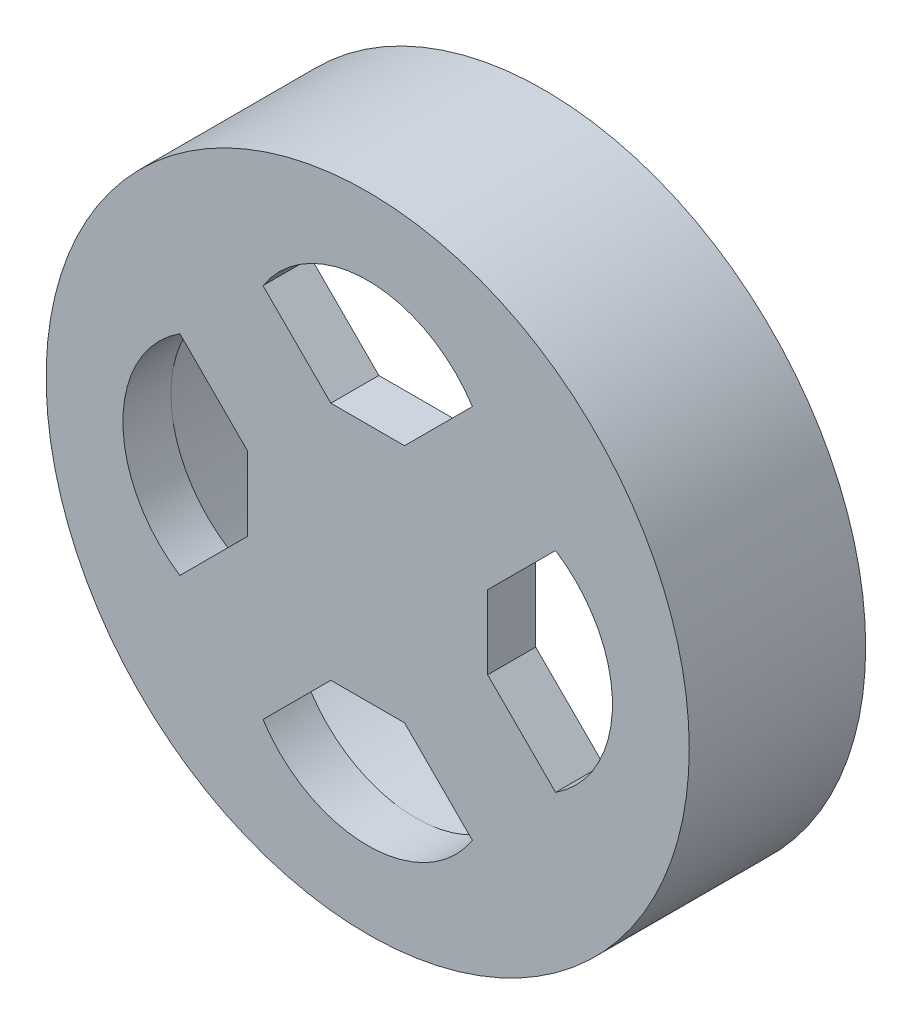
ISO-10303-21;
HEADER;
FILE_DESCRIPTION(('STEP AP214'),'2;1');
FILE_NAME('part.step','',(''),(''),'','','');
FILE_SCHEMA(('AUTOMOTIVE_DESIGN { 1 0 10303 214 1 1 1 1 }'));
ENDSEC;
DATA;
#1=APPLICATION_CONTEXT('core data for automotive mechanical design processes');
#2=APPLICATION_PROTOCOL_DEFINITION('international standard','automotive_design',2000,#1);
#3=PRODUCT_CONTEXT('',#1,'mechanical');
#4=PRODUCT('Part','Part','',(#3));
#5=PRODUCT_RELATED_PRODUCT_CATEGORY('part','',(#4));
#6=PRODUCT_DEFINITION_FORMATION('','',#4);
#7=PRODUCT_DEFINITION_CONTEXT('part definition',#1,'design');
#8=PRODUCT_DEFINITION('design','',#6,#7);
#9=PRODUCT_DEFINITION_SHAPE('','',#8);
#10=(LENGTH_UNIT() NAMED_UNIT(*) SI_UNIT(.MILLI.,.METRE.));
#11=(NAMED_UNIT(*) PLANE_ANGLE_UNIT() SI_UNIT($,.RADIAN.));
#12=(NAMED_UNIT(*) SI_UNIT($,.STERADIAN.) SOLID_ANGLE_UNIT());
#13=UNCERTAINTY_MEASURE_WITH_UNIT(LENGTH_MEASURE(1.E-05),#10,'distance_accuracy_value','');
#14=(GEOMETRIC_REPRESENTATION_CONTEXT(3) GLOBAL_UNCERTAINTY_ASSIGNED_CONTEXT((#13)) GLOBAL_UNIT_ASSIGNED_CONTEXT((#10,
#11,#12)) REPRESENTATION_CONTEXT('',''));
#15=CARTESIAN_POINT('',(0.,0.,0.));
#16=DIRECTION('',(0.,0.,1.));
#17=DIRECTION('',(1.,0.,0.));
#18=AXIS2_PLACEMENT_3D('',#15,#16,#17);
#19=CARTESIAN_POINT('',(0.,0.,18.38));
#20=DIRECTION('',(0.,0.,-1.));
#21=DIRECTION('',(-1.,0.,0.));
#22=AXIS2_PLACEMENT_3D('',#19,#20,#21);
#23=CYLINDRICAL_SURFACE('',#22,33.5);
#24=CARTESIAN_POINT('',(0.,0.,18.38));
#25=DIRECTION('',(0.,0.,1.));
#26=DIRECTION('',(1.,0.,0.));
#27=AXIS2_PLACEMENT_3D('',#24,#25,#26);
#28=CIRCLE('',#27,33.5);
#29=CARTESIAN_POINT('',(33.5,0.,18.38));
#30=VERTEX_POINT('',#29);
#31=EDGE_CURVE('E42',#30,#30,#28,.T.);
#32=ORIENTED_EDGE('',*,*,#31,.F.);
#33=EDGE_LOOP('',(#32));
#34=FACE_BOUND('',#33,.T.);
#35=CARTESIAN_POINT('',(0.,0.,0.));
#36=DIRECTION('',(0.,0.,1.));
#37=DIRECTION('',(1.,0.,0.));
#38=AXIS2_PLACEMENT_3D('',#35,#36,#37);
#39=CIRCLE('',#38,33.5);
#40=CARTESIAN_POINT('',(33.5,0.,0.));
#41=VERTEX_POINT('',#40);
#42=EDGE_CURVE('E365',#41,#41,#39,.T.);
#43=ORIENTED_EDGE('',*,*,#42,.T.);
#44=EDGE_LOOP('',(#43));
#45=FACE_BOUND('',#44,.T.);
#46=ADVANCED_FACE('F35',(#34,#45),#23,.T.);
#47=CARTESIAN_POINT('',(0.,0.,18.38));
#48=DIRECTION('',(0.,0.,1.));
#49=DIRECTION('',(1.,0.,0.));
#50=AXIS2_PLACEMENT_3D('',#47,#48,#49);
#51=PLANE('',#50);
#52=CARTESIAN_POINT('',(0.,12.5,18.38));
#53=DIRECTION('',(0.,0.,1.));
#54=DIRECTION('',(1.,0.,0.));
#55=AXIS2_PLACEMENT_3D('',#52,#53,#54);
#56=CIRCLE('',#55,13.);
#57=CARTESIAN_POINT('',(10.9087121146357,19.5710678118655,18.38));
#58=VERTEX_POINT('',#57);
#59=CARTESIAN_POINT('',(-10.9087121146357,19.5710678118655,18.38));
#60=VERTEX_POINT('',#59);
#61=EDGE_CURVE('E363',#58,#60,#56,.T.);
#62=ORIENTED_EDGE('',*,*,#61,.F.);
#63=DIRECTION('',(0.707106781186546,0.707106781186549,0.));
#64=VECTOR('',#63,1.);
#65=CARTESIAN_POINT('',(-4.33117784861485,4.33117784861483,18.38));
#66=LINE('',#65,#64);
#67=CARTESIAN_POINT('',(3.83764430277029,12.5,18.38));
#68=VERTEX_POINT('',#67);
#69=EDGE_CURVE('E356',#68,#58,#66,.T.);
#70=ORIENTED_EDGE('',*,*,#69,.F.);
#71=DIRECTION('',(1.,0.,0.));
#72=VECTOR('',#71,1.);
#73=CARTESIAN_POINT('',(0.,12.5,18.38));
#74=LINE('',#73,#72);
#75=CARTESIAN_POINT('',(-3.83764430277029,12.5,18.38));
#76=VERTEX_POINT('',#75);
#77=EDGE_CURVE('E358',#76,#68,#74,.T.);
#78=ORIENTED_EDGE('',*,*,#77,.F.);
#79=DIRECTION('',(0.707106781186546,-0.707106781186549,0.));
#80=VECTOR('',#79,1.);
#81=CARTESIAN_POINT('',(4.33117784861485,4.33117784861483,18.38));
#82=LINE('',#81,#80);
#83=EDGE_CURVE('E361',#60,#76,#82,.T.);
#84=ORIENTED_EDGE('',*,*,#83,.F.);
#85=EDGE_LOOP('',(#62,#70,#78,#84));
#86=FACE_BOUND('',#85,.T.);
#87=CARTESIAN_POINT('',(-12.5,0.,18.38));
#88=DIRECTION('',(0.,0.,1.));
#89=DIRECTION('',(1.,0.,0.));
#90=AXIS2_PLACEMENT_3D('',#87,#88,#89);
#91=CIRCLE('',#90,13.);
#92=CARTESIAN_POINT('',(-19.5710678118655,10.9087121146357,18.38));
#93=VERTEX_POINT('',#92);
#94=CARTESIAN_POINT('',(-19.5710678118655,-10.9087121146358,18.38));
#95=VERTEX_POINT('',#94);
#96=EDGE_CURVE('E354',#93,#95,#91,.T.);
#97=ORIENTED_EDGE('',*,*,#96,.F.);
#98=DIRECTION('',(-0.707106781186551,0.707106781186544,0.));
#99=VECTOR('',#98,1.);
#100=CARTESIAN_POINT('',(-4.33117784861482,-4.33117784861486,18.38));
#101=LINE('',#100,#99);
#102=CARTESIAN_POINT('',(-12.5,3.83764430277024,18.38));
#103=VERTEX_POINT('',#102);
#104=EDGE_CURVE('E347',#103,#93,#101,.T.);
#105=ORIENTED_EDGE('',*,*,#104,.F.);
#106=DIRECTION('',(0.,1.,0.));
#107=VECTOR('',#106,1.);
#108=CARTESIAN_POINT('',(-12.5,0.,18.38));
#109=LINE('',#108,#107);
#110=CARTESIAN_POINT('',(-12.5,-3.83764430277033,18.38));
#111=VERTEX_POINT('',#110);
#112=EDGE_CURVE('E349',#111,#103,#109,.T.);
#113=ORIENTED_EDGE('',*,*,#112,.F.);
#114=DIRECTION('',(0.707106781186547,0.707106781186549,0.));
#115=VECTOR('',#114,1.);
#116=CARTESIAN_POINT('',(-4.33117784861484,4.33117784861483,18.38));
#117=LINE('',#116,#115);
#118=EDGE_CURVE('E352',#95,#111,#117,.T.);
#119=ORIENTED_EDGE('',*,*,#118,.F.);
#120=EDGE_LOOP('',(#97,#105,#113,#119));
#121=FACE_BOUND('',#120,.T.);
#122=CARTESIAN_POINT('',(-7.05950310263298E-13,-12.5,18.38));
#123=DIRECTION('',(0.,0.,1.));
#124=DIRECTION('',(1.,0.,0.));
#125=AXIS2_PLACEMENT_3D('',#122,#123,#124);
#126=CIRCLE('',#125,13.);
#127=CARTESIAN_POINT('',(-10.9087121146365,-19.5710678118655,18.38));
#128=VERTEX_POINT('',#127);
#129=CARTESIAN_POINT('',(10.908712114635,-19.5710678118655,18.38));
#130=VERTEX_POINT('',#129);
#131=EDGE_CURVE('E345',#128,#130,#126,.T.);
#132=ORIENTED_EDGE('',*,*,#131,.F.);
#133=DIRECTION('',(-0.707106781186546,-0.707106781186549,0.));
#134=VECTOR('',#133,1.);
#135=CARTESIAN_POINT('',(4.3311778486145,-4.33117784861448,18.38));
#136=LINE('',#135,#134);
#137=CARTESIAN_POINT('',(-3.83764430277099,-12.5,18.38));
#138=VERTEX_POINT('',#137);
#139=EDGE_CURVE('E338',#138,#128,#136,.T.);
#140=ORIENTED_EDGE('',*,*,#139,.F.);
#141=DIRECTION('',(-1.,0.,0.));
#142=VECTOR('',#141,1.);
#143=CARTESIAN_POINT('',(0.,-12.5,18.38));
#144=LINE('',#143,#142);
#145=CARTESIAN_POINT('',(3.83764430276958,-12.5,18.38));
#146=VERTEX_POINT('',#145);
#147=EDGE_CURVE('E340',#146,#138,#144,.T.);
#148=ORIENTED_EDGE('',*,*,#147,.F.);
#149=DIRECTION('',(-0.707106781186546,0.707106781186549,0.));
#150=VECTOR('',#149,1.);
#151=CARTESIAN_POINT('',(-4.3311778486152,-4.33117784861519,18.38));
#152=LINE('',#151,#150);
#153=EDGE_CURVE('E343',#130,#146,#152,.T.);
#154=ORIENTED_EDGE('',*,*,#153,.F.);
#155=EDGE_LOOP('',(#132,#140,#148,#154));
#156=FACE_BOUND('',#155,.T.);
#157=CARTESIAN_POINT('',(12.5,1.30930550206618E-13,18.38));
#158=DIRECTION('',(0.,0.,1.));
#159=DIRECTION('',(1.,0.,0.));
#160=AXIS2_PLACEMENT_3D('',#157,#158,#159);
#161=CIRCLE('',#160,13.);
#162=CARTESIAN_POINT('',(19.5710678118656,-10.9087121146355,18.38));
#163=VERTEX_POINT('',#162);
#164=CARTESIAN_POINT('',(19.5710678118654,10.908712114636,18.38));
#165=VERTEX_POINT('',#164);
#166=EDGE_CURVE('E336',#163,#165,#161,.T.);
#167=ORIENTED_EDGE('',*,*,#166,.F.);
#168=DIRECTION('',(0.707106781186556,-0.707106781186539,0.));
#169=VECTOR('',#168,1.);
#170=CARTESIAN_POINT('',(4.33117784861478,4.33117784861489,18.38));
#171=LINE('',#170,#169);
#172=CARTESIAN_POINT('',(12.5,-3.83764430277016,18.38));
#173=VERTEX_POINT('',#172);
#174=EDGE_CURVE('E284',#173,#163,#171,.T.);
#175=ORIENTED_EDGE('',*,*,#174,.F.);
#176=DIRECTION('',(0.,-1.,0.));
#177=VECTOR('',#176,1.);
#178=CARTESIAN_POINT('',(12.5,1.29958109714157E-13,18.38));
#179=LINE('',#178,#177);
#180=CARTESIAN_POINT('',(12.5,3.83764430277042,18.38));
#181=VERTEX_POINT('',#180);
#182=EDGE_CURVE('E331',#181,#173,#179,.T.);
#183=ORIENTED_EDGE('',*,*,#182,.F.);
#184=DIRECTION('',(-0.707106781186542,-0.707106781186553,0.));
#185=VECTOR('',#184,1.);
#186=CARTESIAN_POINT('',(4.33117784861487,-4.3311778486148,18.38));
#187=LINE('',#186,#185);
#188=EDGE_CURVE('E334',#165,#181,#187,.T.);
#189=ORIENTED_EDGE('',*,*,#188,.F.);
#190=EDGE_LOOP('',(#167,#175,#183,#189));
#191=FACE_BOUND('',#190,.T.);
#192=ORIENTED_EDGE('',*,*,#31,.T.);
#193=EDGE_LOOP('',(#192));
#194=FACE_BOUND('',#193,.T.);
#195=ADVANCED_FACE('F374',(#86,#121,#156,#191,#194),#51,.T.);
#196=CARTESIAN_POINT('',(0.,0.,0.));
#197=DIRECTION('',(0.,0.,1.));
#198=DIRECTION('',(1.,0.,0.));
#199=AXIS2_PLACEMENT_3D('',#196,#197,#198);
#200=PLANE('',#199);
#201=CARTESIAN_POINT('',(0.,0.,0.));
#202=DIRECTION('',(0.,0.,-1.));
#203=DIRECTION('',(-1.,0.,0.));
#204=AXIS2_PLACEMENT_3D('',#201,#202,#203);
#205=CIRCLE('',#204,25.5);
#206=CARTESIAN_POINT('',(-25.5,0.,0.));
#207=VERTEX_POINT('',#206);
#208=EDGE_CURVE('E225',#207,#207,#205,.T.);
#209=ORIENTED_EDGE('',*,*,#208,.F.);
#210=EDGE_LOOP('',(#209));
#211=FACE_BOUND('',#210,.T.);
#212=ORIENTED_EDGE('',*,*,#42,.F.);
#213=EDGE_LOOP('',(#212));
#214=FACE_BOUND('',#213,.T.);
#215=ADVANCED_FACE('F371',(#211,#214),#200,.F.);
#216=CARTESIAN_POINT('',(12.5,1.30930550206618E-13,18.5));
#217=DIRECTION('',(0.,0.,-1.));
#218=DIRECTION('',(-1.,0.,0.));
#219=AXIS2_PLACEMENT_3D('',#216,#217,#218);
#220=CYLINDRICAL_SURFACE('',#219,13.);
#221=CARTESIAN_POINT('',(12.5,1.30930550206618E-13,13.38));
#222=DIRECTION('',(0.,0.,1.));
#223=DIRECTION('',(1.,0.,0.));
#224=AXIS2_PLACEMENT_3D('',#221,#222,#223);
#225=CIRCLE('',#224,13.);
#226=CARTESIAN_POINT('',(19.5710678118654,10.908712114636,13.38));
#227=VERTEX_POINT('',#226);
#228=CARTESIAN_POINT('',(25.5,2.670983224215E-13,13.38));
#229=VERTEX_POINT('',#228);
#230=EDGE_CURVE('E277',#227,#229,#225,.F.);
#231=ORIENTED_EDGE('',*,*,#230,.T.);
#232=CARTESIAN_POINT('',(19.5710678118656,-10.9087121146355,13.38));
#233=VERTEX_POINT('',#232);
#234=EDGE_CURVE('E280',#229,#233,#225,.F.);
#235=ORIENTED_EDGE('',*,*,#234,.T.);
#236=DIRECTION('',(0.,0.,-1.));
#237=VECTOR('',#236,1.);
#238=CARTESIAN_POINT('',(19.5710678118656,-10.9087121146355,18.5));
#239=LINE('',#238,#237);
#240=EDGE_CURVE('E327',#163,#233,#239,.T.);
#241=ORIENTED_EDGE('',*,*,#240,.F.);
#242=ORIENTED_EDGE('',*,*,#166,.T.);
#243=DIRECTION('',(0.,0.,-1.));
#244=VECTOR('',#243,1.);
#245=CARTESIAN_POINT('',(19.5710678118654,10.908712114636,18.5));
#246=LINE('',#245,#244);
#247=EDGE_CURVE('E318',#165,#227,#246,.T.);
#248=ORIENTED_EDGE('',*,*,#247,.T.);
#249=EDGE_LOOP('',(#231,#235,#241,#242,#248));
#250=FACE_BOUND('',#249,.T.);
#251=ADVANCED_FACE('F373',(#250),#220,.F.);
#252=CARTESIAN_POINT('',(12.5,3.83764430277042,18.5));
#253=DIRECTION('',(-0.707106781186553,0.707106781186542,0.));
#254=DIRECTION('',(-0.707106781186542,-0.707106781186553,0.));
#255=AXIS2_PLACEMENT_3D('',#252,#253,#254);
#256=PLANE('',#255);
#257=DIRECTION('',(0.,0.,-1.));
#258=VECTOR('',#257,1.);
#259=CARTESIAN_POINT('',(12.5,3.83764430277042,18.5));
#260=LINE('',#259,#258);
#261=CARTESIAN_POINT('',(12.5,3.83764430277042,13.38));
#262=VERTEX_POINT('',#261);
#263=EDGE_CURVE('E321',#181,#262,#260,.T.);
#264=ORIENTED_EDGE('',*,*,#263,.T.);
#265=DIRECTION('',(0.707106781186542,0.707106781186553,0.));
#266=VECTOR('',#265,1.);
#267=CARTESIAN_POINT('',(12.5,3.83764430277042,13.38));
#268=LINE('',#267,#266);
#269=EDGE_CURVE('E274',#262,#227,#268,.T.);
#270=ORIENTED_EDGE('',*,*,#269,.T.);
#271=ORIENTED_EDGE('',*,*,#247,.F.);
#272=ORIENTED_EDGE('',*,*,#188,.T.);
#273=EDGE_LOOP('',(#264,#270,#271,#272));
#274=FACE_BOUND('',#273,.T.);
#275=ADVANCED_FACE('F380',(#274),#256,.F.);
#276=CARTESIAN_POINT('',(12.5,-3.83764430277016,18.5));
#277=DIRECTION('',(-1.,0.,0.));
#278=DIRECTION('',(0.,-1.,0.));
#279=AXIS2_PLACEMENT_3D('',#276,#277,#278);
#280=PLANE('',#279);
#281=DIRECTION('',(0.,0.,-1.));
#282=VECTOR('',#281,1.);
#283=CARTESIAN_POINT('',(12.5,-3.83764430277016,18.5));
#284=LINE('',#283,#282);
#285=CARTESIAN_POINT('',(12.5,-3.83764430277016,13.38));
#286=VERTEX_POINT('',#285);
#287=EDGE_CURVE('E324',#173,#286,#284,.T.);
#288=ORIENTED_EDGE('',*,*,#287,.T.);
#289=DIRECTION('',(0.,1.,0.));
#290=VECTOR('',#289,1.);
#291=CARTESIAN_POINT('',(12.5,-3.83764430277016,13.38));
#292=LINE('',#291,#290);
#293=EDGE_CURVE('E57',#286,#262,#292,.T.);
#294=ORIENTED_EDGE('',*,*,#293,.T.);
#295=ORIENTED_EDGE('',*,*,#263,.F.);
#296=ORIENTED_EDGE('',*,*,#182,.T.);
#297=EDGE_LOOP('',(#288,#294,#295,#296));
#298=FACE_BOUND('',#297,.T.);
#299=ADVANCED_FACE('F415',(#298),#280,.F.);
#300=CARTESIAN_POINT('',(19.5710678118656,-10.9087121146355,18.5));
#301=DIRECTION('',(-0.707106781186539,-0.707106781186556,0.));
#302=DIRECTION('',(0.707106781186556,-0.707106781186539,0.));
#303=AXIS2_PLACEMENT_3D('',#300,#301,#302);
#304=PLANE('',#303);
#305=ORIENTED_EDGE('',*,*,#240,.T.);
#306=DIRECTION('',(-0.707106781186556,0.707106781186539,0.));
#307=VECTOR('',#306,1.);
#308=CARTESIAN_POINT('',(19.5710678118656,-10.9087121146355,13.38));
#309=LINE('',#308,#307);
#310=EDGE_CURVE('E271',#233,#286,#309,.T.);
#311=ORIENTED_EDGE('',*,*,#310,.T.);
#312=ORIENTED_EDGE('',*,*,#287,.F.);
#313=ORIENTED_EDGE('',*,*,#174,.T.);
#314=EDGE_LOOP('',(#305,#311,#312,#313));
#315=FACE_BOUND('',#314,.T.);
#316=ADVANCED_FACE('F425',(#315),#304,.F.);
#317=CARTESIAN_POINT('',(-7.05950310263298E-13,-12.5,18.5));
#318=DIRECTION('',(0.,0.,-1.));
#319=DIRECTION('',(-1.,0.,0.));
#320=AXIS2_PLACEMENT_3D('',#317,#318,#319);
#321=CYLINDRICAL_SURFACE('',#320,13.);
#322=CARTESIAN_POINT('',(-7.05950310263298E-13,-12.5,13.38));
#323=DIRECTION('',(0.,0.,1.));
#324=DIRECTION('',(1.,0.,0.));
#325=AXIS2_PLACEMENT_3D('',#322,#323,#324);
#326=CIRCLE('',#325,13.);
#327=CARTESIAN_POINT('',(10.908712114635,-19.5710678118655,13.38));
#328=VERTEX_POINT('',#327);
#329=CARTESIAN_POINT('',(-1.44013863293713E-12,-25.5,13.38));
#330=VERTEX_POINT('',#329);
#331=EDGE_CURVE('E267',#328,#330,#326,.F.);
#332=ORIENTED_EDGE('',*,*,#331,.T.);
#333=CARTESIAN_POINT('',(-10.9087121146365,-19.5710678118655,13.38));
#334=VERTEX_POINT('',#333);
#335=EDGE_CURVE('E270',#330,#334,#326,.F.);
#336=ORIENTED_EDGE('',*,*,#335,.T.);
#337=DIRECTION('',(0.,0.,-1.));
#338=VECTOR('',#337,1.);
#339=CARTESIAN_POINT('',(-10.9087121146365,-19.5710678118655,18.5));
#340=LINE('',#339,#338);
#341=EDGE_CURVE('E315',#128,#334,#340,.T.);
#342=ORIENTED_EDGE('',*,*,#341,.F.);
#343=ORIENTED_EDGE('',*,*,#131,.T.);
#344=DIRECTION('',(0.,0.,-1.));
#345=VECTOR('',#344,1.);
#346=CARTESIAN_POINT('',(10.908712114635,-19.5710678118655,18.5));
#347=LINE('',#346,#345);
#348=EDGE_CURVE('E306',#130,#328,#347,.T.);
#349=ORIENTED_EDGE('',*,*,#348,.T.);
#350=EDGE_LOOP('',(#332,#336,#342,#343,#349));
#351=FACE_BOUND('',#350,.T.);
#352=ADVANCED_FACE('F435',(#351),#321,.F.);
#353=CARTESIAN_POINT('',(3.83764430276958,-12.5,18.5));
#354=DIRECTION('',(0.707106781186549,0.707106781186546,0.));
#355=DIRECTION('',(-0.707106781186546,0.707106781186549,0.));
#356=AXIS2_PLACEMENT_3D('',#353,#354,#355);
#357=PLANE('',#356);
#358=DIRECTION('',(0.,0.,-1.));
#359=VECTOR('',#358,1.);
#360=CARTESIAN_POINT('',(3.83764430276958,-12.5,18.5));
#361=LINE('',#360,#359);
#362=CARTESIAN_POINT('',(3.83764430276958,-12.5,13.38));
#363=VERTEX_POINT('',#362);
#364=EDGE_CURVE('E309',#146,#363,#361,.T.);
#365=ORIENTED_EDGE('',*,*,#364,.T.);
#366=DIRECTION('',(0.707106781186546,-0.707106781186549,0.));
#367=VECTOR('',#366,1.);
#368=CARTESIAN_POINT('',(3.83764430276958,-12.5,13.38));
#369=LINE('',#368,#367);
#370=EDGE_CURVE('E264',#363,#328,#369,.T.);
#371=ORIENTED_EDGE('',*,*,#370,.T.);
#372=ORIENTED_EDGE('',*,*,#348,.F.);
#373=ORIENTED_EDGE('',*,*,#153,.T.);
#374=EDGE_LOOP('',(#365,#371,#372,#373));
#375=FACE_BOUND('',#374,.T.);
#376=ADVANCED_FACE('F445',(#375),#357,.F.);
#377=CARTESIAN_POINT('',(-3.83764430277099,-12.5,18.5));
#378=DIRECTION('',(0.,1.,0.));
#379=DIRECTION('',(0.,0.,1.));
#380=AXIS2_PLACEMENT_3D('',#377,#378,#379);
#381=PLANE('',#380);
#382=DIRECTION('',(0.,0.,-1.));
#383=VECTOR('',#382,1.);
#384=CARTESIAN_POINT('',(-3.83764430277099,-12.5,18.5));
#385=LINE('',#384,#383);
#386=CARTESIAN_POINT('',(-3.83764430277099,-12.5,13.38));
#387=VERTEX_POINT('',#386);
#388=EDGE_CURVE('E312',#138,#387,#385,.T.);
#389=ORIENTED_EDGE('',*,*,#388,.T.);
#390=DIRECTION('',(1.,0.,0.));
#391=VECTOR('',#390,1.);
#392=CARTESIAN_POINT('',(-3.83764430277099,-12.5,13.38));
#393=LINE('',#392,#391);
#394=EDGE_CURVE('E261',#387,#363,#393,.T.);
#395=ORIENTED_EDGE('',*,*,#394,.T.);
#396=ORIENTED_EDGE('',*,*,#364,.F.);
#397=ORIENTED_EDGE('',*,*,#147,.T.);
#398=EDGE_LOOP('',(#389,#395,#396,#397));
#399=FACE_BOUND('',#398,.T.);
#400=ADVANCED_FACE('F455',(#399),#381,.F.);
#401=CARTESIAN_POINT('',(-10.9087121146365,-19.5710678118655,18.5));
#402=DIRECTION('',(-0.707106781186549,0.707106781186546,0.));
#403=DIRECTION('',(-0.707106781186546,-0.707106781186549,0.));
#404=AXIS2_PLACEMENT_3D('',#401,#402,#403);
#405=PLANE('',#404);
#406=ORIENTED_EDGE('',*,*,#341,.T.);
#407=DIRECTION('',(0.707106781186546,0.707106781186549,0.));
#408=VECTOR('',#407,1.);
#409=CARTESIAN_POINT('',(-10.9087121146365,-19.5710678118655,13.38));
#410=LINE('',#409,#408);
#411=EDGE_CURVE('E258',#334,#387,#410,.T.);
#412=ORIENTED_EDGE('',*,*,#411,.T.);
#413=ORIENTED_EDGE('',*,*,#388,.F.);
#414=ORIENTED_EDGE('',*,*,#139,.T.);
#415=EDGE_LOOP('',(#406,#412,#413,#414));
#416=FACE_BOUND('',#415,.T.);
#417=ADVANCED_FACE('F465',(#416),#405,.F.);
#418=CARTESIAN_POINT('',(-12.5,0.,18.5));
#419=DIRECTION('',(0.,0.,-1.));
#420=DIRECTION('',(-1.,0.,0.));
#421=AXIS2_PLACEMENT_3D('',#418,#419,#420);
#422=CYLINDRICAL_SURFACE('',#421,13.);
#423=DIRECTION('',(0.,0.,-1.));
#424=VECTOR('',#423,1.);
#425=CARTESIAN_POINT('',(-19.5710678118655,-10.9087121146358,18.5));
#426=LINE('',#425,#424);
#427=CARTESIAN_POINT('',(-19.5710678118655,-10.9087121146358,13.38));
#428=VERTEX_POINT('',#427);
#429=EDGE_CURVE('E294',#95,#428,#426,.T.);
#430=ORIENTED_EDGE('',*,*,#429,.T.);
#431=CARTESIAN_POINT('',(-12.5,0.,13.38));
#432=DIRECTION('',(0.,0.,1.));
#433=DIRECTION('',(1.,0.,0.));
#434=AXIS2_PLACEMENT_3D('',#431,#432,#433);
#435=CIRCLE('',#434,13.);
#436=CARTESIAN_POINT('',(-25.5,0.,13.38));
#437=VERTEX_POINT('',#436);
#438=EDGE_CURVE('E257',#428,#437,#435,.F.);
#439=ORIENTED_EDGE('',*,*,#438,.T.);
#440=CARTESIAN_POINT('',(-19.5710678118655,10.9087121146357,13.38));
#441=VERTEX_POINT('',#440);
#442=EDGE_CURVE('E254',#437,#441,#435,.F.);
#443=ORIENTED_EDGE('',*,*,#442,.T.);
#444=DIRECTION('',(0.,0.,-1.));
#445=VECTOR('',#444,1.);
#446=CARTESIAN_POINT('',(-19.5710678118655,10.9087121146357,18.5));
#447=LINE('',#446,#445);
#448=EDGE_CURVE('E303',#93,#441,#447,.T.);
#449=ORIENTED_EDGE('',*,*,#448,.F.);
#450=ORIENTED_EDGE('',*,*,#96,.T.);
#451=EDGE_LOOP('',(#430,#439,#443,#449,#450));
#452=FACE_BOUND('',#451,.T.);
#453=ADVANCED_FACE('F475',(#452),#422,.F.);
#454=CARTESIAN_POINT('',(-12.5,-3.83764430277033,18.5));
#455=DIRECTION('',(0.707106781186549,-0.707106781186547,0.));
#456=DIRECTION('',(0.707106781186547,0.707106781186549,0.));
#457=AXIS2_PLACEMENT_3D('',#454,#455,#456);
#458=PLANE('',#457);
#459=DIRECTION('',(0.,0.,-1.));
#460=VECTOR('',#459,1.);
#461=CARTESIAN_POINT('',(-12.5,-3.83764430277033,18.5));
#462=LINE('',#461,#460);
#463=CARTESIAN_POINT('',(-12.5,-3.83764430277033,13.38));
#464=VERTEX_POINT('',#463);
#465=EDGE_CURVE('E297',#111,#464,#462,.T.);
#466=ORIENTED_EDGE('',*,*,#465,.T.);
#467=DIRECTION('',(-0.707106781186547,-0.707106781186549,0.));
#468=VECTOR('',#467,1.);
#469=CARTESIAN_POINT('',(-12.5,-3.83764430277033,13.38));
#470=LINE('',#469,#468);
#471=EDGE_CURVE('E251',#464,#428,#470,.T.);
#472=ORIENTED_EDGE('',*,*,#471,.T.);
#473=ORIENTED_EDGE('',*,*,#429,.F.);
#474=ORIENTED_EDGE('',*,*,#118,.T.);
#475=EDGE_LOOP('',(#466,#472,#473,#474));
#476=FACE_BOUND('',#475,.T.);
#477=ADVANCED_FACE('F485',(#476),#458,.F.);
#478=CARTESIAN_POINT('',(-12.5,3.83764430277024,18.5));
#479=DIRECTION('',(1.,0.,0.));
#480=DIRECTION('',(0.,1.,0.));
#481=AXIS2_PLACEMENT_3D('',#478,#479,#480);
#482=PLANE('',#481);
#483=DIRECTION('',(0.,0.,-1.));
#484=VECTOR('',#483,1.);
#485=CARTESIAN_POINT('',(-12.5,3.83764430277024,18.5));
#486=LINE('',#485,#484);
#487=CARTESIAN_POINT('',(-12.5,3.83764430277024,13.38));
#488=VERTEX_POINT('',#487);
#489=EDGE_CURVE('E300',#103,#488,#486,.T.);
#490=ORIENTED_EDGE('',*,*,#489,.T.);
#491=DIRECTION('',(0.,-1.,0.));
#492=VECTOR('',#491,1.);
#493=CARTESIAN_POINT('',(-12.5,3.83764430277024,13.38));
#494=LINE('',#493,#492);
#495=EDGE_CURVE('E248',#488,#464,#494,.T.);
#496=ORIENTED_EDGE('',*,*,#495,.T.);
#497=ORIENTED_EDGE('',*,*,#465,.F.);
#498=ORIENTED_EDGE('',*,*,#112,.T.);
#499=EDGE_LOOP('',(#490,#496,#497,#498));
#500=FACE_BOUND('',#499,.T.);
#501=ADVANCED_FACE('F495',(#500),#482,.F.);
#502=CARTESIAN_POINT('',(-19.5710678118655,10.9087121146357,18.5));
#503=DIRECTION('',(0.707106781186544,0.707106781186552,0.));
#504=DIRECTION('',(-0.707106781186551,0.707106781186544,0.));
#505=AXIS2_PLACEMENT_3D('',#502,#503,#504);
#506=PLANE('',#505);
#507=ORIENTED_EDGE('',*,*,#448,.T.);
#508=DIRECTION('',(0.707106781186551,-0.707106781186544,0.));
#509=VECTOR('',#508,1.);
#510=CARTESIAN_POINT('',(-19.5710678118655,10.9087121146357,13.38));
#511=LINE('',#510,#509);
#512=EDGE_CURVE('E245',#441,#488,#511,.T.);
#513=ORIENTED_EDGE('',*,*,#512,.T.);
#514=ORIENTED_EDGE('',*,*,#489,.F.);
#515=ORIENTED_EDGE('',*,*,#104,.T.);
#516=EDGE_LOOP('',(#507,#513,#514,#515));
#517=FACE_BOUND('',#516,.T.);
#518=ADVANCED_FACE('F505',(#517),#506,.F.);
#519=CARTESIAN_POINT('',(0.,12.5,18.5));
#520=DIRECTION('',(0.,0.,-1.));
#521=DIRECTION('',(-1.,0.,0.));
#522=AXIS2_PLACEMENT_3D('',#519,#520,#521);
#523=CYLINDRICAL_SURFACE('',#522,13.);
#524=DIRECTION('',(0.,0.,-1.));
#525=VECTOR('',#524,1.);
#526=CARTESIAN_POINT('',(-10.9087121146357,19.5710678118655,18.5));
#527=LINE('',#526,#525);
#528=CARTESIAN_POINT('',(-10.9087121146357,19.5710678118655,13.38));
#529=VERTEX_POINT('',#528);
#530=EDGE_CURVE('E281',#60,#529,#527,.T.);
#531=ORIENTED_EDGE('',*,*,#530,.T.);
#532=CARTESIAN_POINT('',(0.,12.5,13.38));
#533=DIRECTION('',(0.,0.,1.));
#534=DIRECTION('',(1.,0.,0.));
#535=AXIS2_PLACEMENT_3D('',#532,#533,#534);
#536=CIRCLE('',#535,13.);
#537=CARTESIAN_POINT('',(0.,25.5,13.38));
#538=VERTEX_POINT('',#537);
#539=EDGE_CURVE('E244',#529,#538,#536,.F.);
#540=ORIENTED_EDGE('',*,*,#539,.T.);
#541=CARTESIAN_POINT('',(10.9087121146357,19.5710678118655,13.38));
#542=VERTEX_POINT('',#541);
#543=EDGE_CURVE('E241',#538,#542,#536,.F.);
#544=ORIENTED_EDGE('',*,*,#543,.T.);
#545=DIRECTION('',(0.,0.,-1.));
#546=VECTOR('',#545,1.);
#547=CARTESIAN_POINT('',(10.9087121146357,19.5710678118655,18.5));
#548=LINE('',#547,#546);
#549=EDGE_CURVE('E291',#58,#542,#548,.T.);
#550=ORIENTED_EDGE('',*,*,#549,.F.);
#551=ORIENTED_EDGE('',*,*,#61,.T.);
#552=EDGE_LOOP('',(#531,#540,#544,#550,#551));
#553=FACE_BOUND('',#552,.T.);
#554=ADVANCED_FACE('F515',(#553),#523,.F.);
#555=CARTESIAN_POINT('',(-3.83764430277029,12.5,18.5));
#556=DIRECTION('',(-0.707106781186549,-0.707106781186546,0.));
#557=DIRECTION('',(0.707106781186546,-0.707106781186549,0.));
#558=AXIS2_PLACEMENT_3D('',#555,#556,#557);
#559=PLANE('',#558);
#560=DIRECTION('',(0.,0.,-1.));
#561=VECTOR('',#560,1.);
#562=CARTESIAN_POINT('',(-3.83764430277029,12.5,18.5));
#563=LINE('',#562,#561);
#564=CARTESIAN_POINT('',(-3.83764430277029,12.5,13.38));
#565=VERTEX_POINT('',#564);
#566=EDGE_CURVE('E285',#76,#565,#563,.T.);
#567=ORIENTED_EDGE('',*,*,#566,.T.);
#568=DIRECTION('',(-0.707106781186546,0.707106781186549,0.));
#569=VECTOR('',#568,1.);
#570=CARTESIAN_POINT('',(-3.83764430277029,12.5,13.38));
#571=LINE('',#570,#569);
#572=EDGE_CURVE('E238',#565,#529,#571,.T.);
#573=ORIENTED_EDGE('',*,*,#572,.T.);
#574=ORIENTED_EDGE('',*,*,#530,.F.);
#575=ORIENTED_EDGE('',*,*,#83,.T.);
#576=EDGE_LOOP('',(#567,#573,#574,#575));
#577=FACE_BOUND('',#576,.T.);
#578=ADVANCED_FACE('F525',(#577),#559,.F.);
#579=CARTESIAN_POINT('',(3.83764430277029,12.5,18.5));
#580=DIRECTION('',(0.,-1.,0.));
#581=DIRECTION('',(0.,0.,-1.));
#582=AXIS2_PLACEMENT_3D('',#579,#580,#581);
#583=PLANE('',#582);
#584=DIRECTION('',(0.,0.,-1.));
#585=VECTOR('',#584,1.);
#586=CARTESIAN_POINT('',(3.83764430277029,12.5,18.5));
#587=LINE('',#586,#585);
#588=CARTESIAN_POINT('',(3.83764430277029,12.5,13.38));
#589=VERTEX_POINT('',#588);
#590=EDGE_CURVE('E288',#68,#589,#587,.T.);
#591=ORIENTED_EDGE('',*,*,#590,.T.);
#592=DIRECTION('',(-1.,0.,0.));
#593=VECTOR('',#592,1.);
#594=CARTESIAN_POINT('',(3.83764430277029,12.5,13.38));
#595=LINE('',#594,#593);
#596=EDGE_CURVE('E232',#589,#565,#595,.T.);
#597=ORIENTED_EDGE('',*,*,#596,.T.);
#598=ORIENTED_EDGE('',*,*,#566,.F.);
#599=ORIENTED_EDGE('',*,*,#77,.T.);
#600=EDGE_LOOP('',(#591,#597,#598,#599));
#601=FACE_BOUND('',#600,.T.);
#602=ADVANCED_FACE('F535',(#601),#583,.F.);
#603=CARTESIAN_POINT('',(10.9087121146357,19.5710678118655,18.5));
#604=DIRECTION('',(0.707106781186549,-0.707106781186546,0.));
#605=DIRECTION('',(0.707106781186546,0.707106781186549,0.));
#606=AXIS2_PLACEMENT_3D('',#603,#604,#605);
#607=PLANE('',#606);
#608=ORIENTED_EDGE('',*,*,#549,.T.);
#609=DIRECTION('',(-0.707106781186546,-0.707106781186549,0.));
#610=VECTOR('',#609,1.);
#611=CARTESIAN_POINT('',(10.9087121146357,19.5710678118655,13.38));
#612=LINE('',#611,#610);
#613=EDGE_CURVE('E12',#542,#589,#612,.T.);
#614=ORIENTED_EDGE('',*,*,#613,.T.);
#615=ORIENTED_EDGE('',*,*,#590,.F.);
#616=ORIENTED_EDGE('',*,*,#69,.T.);
#617=EDGE_LOOP('',(#608,#614,#615,#616));
#618=FACE_BOUND('',#617,.T.);
#619=ADVANCED_FACE('F545',(#618),#607,.F.);
#620=CARTESIAN_POINT('',(0.,0.,90.504891681028));
#621=DIRECTION('',(0.,0.,-1.));
#622=DIRECTION('',(-1.,0.,0.));
#623=AXIS2_PLACEMENT_3D('',#620,#621,#622);
#624=CYLINDRICAL_SURFACE('',#623,25.5);
#625=ORIENTED_EDGE('',*,*,#208,.T.);
#626=EDGE_LOOP('',(#625));
#627=FACE_BOUND('',#626,.T.);
#628=CARTESIAN_POINT('',(0.,0.,13.38));
#629=DIRECTION('',(0.,0.,1.));
#630=DIRECTION('',(1.,0.,0.));
#631=AXIS2_PLACEMENT_3D('',#628,#629,#630);
#632=CIRCLE('',#631,25.5);
#633=EDGE_CURVE('E224',#538,#229,#632,.F.);
#634=ORIENTED_EDGE('',*,*,#633,.F.);
#635=EDGE_CURVE('E672',#437,#538,#632,.F.);
#636=ORIENTED_EDGE('',*,*,#635,.F.);
#637=EDGE_CURVE('E235',#330,#437,#632,.F.);
#638=ORIENTED_EDGE('',*,*,#637,.F.);
#639=EDGE_CURVE('E229',#229,#330,#632,.F.);
#640=ORIENTED_EDGE('',*,*,#639,.F.);
#641=EDGE_LOOP('',(#634,#636,#638,#640));
#642=FACE_BOUND('',#641,.T.);
#643=ADVANCED_FACE('F555',(#627,#642),#624,.F.);
#644=CARTESIAN_POINT('',(0.,0.,13.38));
#645=DIRECTION('',(0.,0.,1.));
#646=DIRECTION('',(1.,0.,0.));
#647=AXIS2_PLACEMENT_3D('',#644,#645,#646);
#648=PLANE('',#647);
#649=CARTESIAN_POINT('',(0.,0.,13.38));
#650=DIRECTION('',(0.,0.,1.));
#651=DIRECTION('',(1.,0.,0.));
#652=AXIS2_PLACEMENT_3D('',#649,#650,#651);
#653=CIRCLE('',#652,6.);
#654=CARTESIAN_POINT('',(6.,0.,13.38));
#655=VERTEX_POINT('',#654);
#656=EDGE_CURVE('E228',#655,#655,#653,.F.);
#657=ORIENTED_EDGE('',*,*,#656,.F.);
#658=EDGE_LOOP('',(#657));
#659=FACE_BOUND('',#658,.T.);
#660=ORIENTED_EDGE('',*,*,#639,.T.);
#661=ORIENTED_EDGE('',*,*,#331,.F.);
#662=ORIENTED_EDGE('',*,*,#370,.F.);
#663=ORIENTED_EDGE('',*,*,#394,.F.);
#664=ORIENTED_EDGE('',*,*,#411,.F.);
#665=ORIENTED_EDGE('',*,*,#335,.F.);
#666=ORIENTED_EDGE('',*,*,#637,.T.);
#667=ORIENTED_EDGE('',*,*,#438,.F.);
#668=ORIENTED_EDGE('',*,*,#471,.F.);
#669=ORIENTED_EDGE('',*,*,#495,.F.);
#670=ORIENTED_EDGE('',*,*,#512,.F.);
#671=ORIENTED_EDGE('',*,*,#442,.F.);
#672=ORIENTED_EDGE('',*,*,#635,.T.);
#673=ORIENTED_EDGE('',*,*,#539,.F.);
#674=ORIENTED_EDGE('',*,*,#572,.F.);
#675=ORIENTED_EDGE('',*,*,#596,.F.);
#676=ORIENTED_EDGE('',*,*,#613,.F.);
#677=ORIENTED_EDGE('',*,*,#543,.F.);
#678=ORIENTED_EDGE('',*,*,#633,.T.);
#679=ORIENTED_EDGE('',*,*,#230,.F.);
#680=ORIENTED_EDGE('',*,*,#269,.F.);
#681=ORIENTED_EDGE('',*,*,#293,.F.);
#682=ORIENTED_EDGE('',*,*,#310,.F.);
#683=ORIENTED_EDGE('',*,*,#234,.F.);
#684=EDGE_LOOP('',(#660,#661,#662,#663,#664,#665,#666,#667,#668,#669,#670,#671,#672,#673,#674,
#675,#676,#677,#678,#679,#680,#681,#682,#683));
#685=FACE_BOUND('',#684,.T.);
#686=ADVANCED_FACE('F565',(#659,#685),#648,.F.);
#687=CARTESIAN_POINT('',(0.,0.,90.504891681028));
#688=DIRECTION('',(0.,0.,-1.));
#689=DIRECTION('',(-1.,0.,0.));
#690=AXIS2_PLACEMENT_3D('',#687,#688,#689);
#691=CYLINDRICAL_SURFACE('',#690,6.);
#692=ORIENTED_EDGE('',*,*,#656,.T.);
#693=EDGE_LOOP('',(#692));
#694=FACE_BOUND('',#693,.T.);
#695=CARTESIAN_POINT('',(0.,0.,-3.));
#696=DIRECTION('',(0.,0.,-1.));
#697=DIRECTION('',(-1.,0.,0.));
#698=AXIS2_PLACEMENT_3D('',#695,#696,#697);
#699=CIRCLE('',#698,6.);
#700=CARTESIAN_POINT('',(-6.,0.,-3.));
#701=VERTEX_POINT('',#700);
#702=EDGE_CURVE('E218',#701,#701,#699,.T.);
#703=ORIENTED_EDGE('',*,*,#702,.F.);
#704=EDGE_LOOP('',(#703));
#705=FACE_BOUND('',#704,.T.);
#706=ADVANCED_FACE('F575',(#694,#705),#691,.T.);
#707=CARTESIAN_POINT('',(0.,0.,-3.));
#708=DIRECTION('',(0.,0.,-1.));
#709=DIRECTION('',(-1.,0.,0.));
#710=AXIS2_PLACEMENT_3D('',#707,#708,#709);
#711=PLANE('',#710);
#712=CARTESIAN_POINT('',(0.,0.,-3.));
#713=DIRECTION('',(0.,0.,-1.));
#714=DIRECTION('',(-1.,0.,0.));
#715=AXIS2_PLACEMENT_3D('',#712,#713,#714);
#716=CIRCLE('',#715,2.7);
#717=CARTESIAN_POINT('',(1.94758825217242,1.87,-3.));
#718=VERTEX_POINT('',#717);
#719=CARTESIAN_POINT('',(1.94758825217241,-1.87,-3.));
#720=VERTEX_POINT('',#719);
#721=EDGE_CURVE('E49',#718,#720,#716,.T.);
#722=ORIENTED_EDGE('',*,*,#721,.F.);
#723=DIRECTION('',(1.,0.,0.));
#724=VECTOR('',#723,1.);
#725=CARTESIAN_POINT('',(1.94758825217242,1.87,-3.));
#726=LINE('',#725,#724);
#727=CARTESIAN_POINT('',(-1.94758825217241,1.87,-3.));
#728=VERTEX_POINT('',#727);
#729=EDGE_CURVE('E203',#728,#718,#726,.T.);
#730=ORIENTED_EDGE('',*,*,#729,.F.);
#731=CARTESIAN_POINT('',(0.,0.,-3.));
#732=DIRECTION('',(0.,0.,-1.));
#733=DIRECTION('',(-1.,0.,0.));
#734=AXIS2_PLACEMENT_3D('',#731,#732,#733);
#735=CIRCLE('',#734,2.7);
#736=CARTESIAN_POINT('',(-1.94758825217241,-1.87,-3.));
#737=VERTEX_POINT('',#736);
#738=EDGE_CURVE('E206',#737,#728,#735,.T.);
#739=ORIENTED_EDGE('',*,*,#738,.F.);
#740=DIRECTION('',(-1.,0.,0.));
#741=VECTOR('',#740,1.);
#742=CARTESIAN_POINT('',(1.94758825217241,-1.87,-3.));
#743=LINE('',#742,#741);
#744=EDGE_CURVE('E212',#720,#737,#743,.T.);
#745=ORIENTED_EDGE('',*,*,#744,.F.);
#746=EDGE_LOOP('',(#722,#730,#739,#745));
#747=FACE_BOUND('',#746,.T.);
#748=ORIENTED_EDGE('',*,*,#702,.T.);
#749=EDGE_LOOP('',(#748));
#750=FACE_BOUND('',#749,.T.);
#751=ADVANCED_FACE('F586',(#747,#750),#711,.T.);
#752=CARTESIAN_POINT('',(0.,0.,9.));
#753=DIRECTION('',(0.,0.,-1.));
#754=DIRECTION('',(-1.,0.,0.));
#755=AXIS2_PLACEMENT_3D('',#752,#753,#754);
#756=CYLINDRICAL_SURFACE('',#755,2.7);
#757=ORIENTED_EDGE('',*,*,#721,.T.);
#758=DIRECTION('',(0.,0.,-1.));
#759=VECTOR('',#758,1.);
#760=CARTESIAN_POINT('',(1.94758825217241,-1.87,9.));
#761=LINE('',#760,#759);
#762=CARTESIAN_POINT('',(1.94758825217241,-1.87,9.));
#763=VERTEX_POINT('',#762);
#764=EDGE_CURVE('E181',#763,#720,#761,.T.);
#765=ORIENTED_EDGE('',*,*,#764,.F.);
#766=CARTESIAN_POINT('',(0.,0.,9.));
#767=DIRECTION('',(0.,0.,-1.));
#768=DIRECTION('',(-1.,0.,0.));
#769=AXIS2_PLACEMENT_3D('',#766,#767,#768);
#770=CIRCLE('',#769,2.7);
#771=CARTESIAN_POINT('',(1.94758825217242,1.87,9.));
#772=VERTEX_POINT('',#771);
#773=EDGE_CURVE('E185',#772,#763,#770,.T.);
#774=ORIENTED_EDGE('',*,*,#773,.F.);
#775=DIRECTION('',(0.,0.,-1.));
#776=VECTOR('',#775,1.);
#777=CARTESIAN_POINT('',(1.94758825217242,1.87,9.));
#778=LINE('',#777,#776);
#779=EDGE_CURVE('E216',#772,#718,#778,.T.);
#780=ORIENTED_EDGE('',*,*,#779,.T.);
#781=EDGE_LOOP('',(#757,#765,#774,#780));
#782=FACE_BOUND('',#781,.T.);
#783=ADVANCED_FACE('F183',(#782),#756,.F.);
#784=CARTESIAN_POINT('',(1.94758825217242,1.87,9.));
#785=DIRECTION('',(0.,1.,0.));
#786=DIRECTION('',(-1.,0.,0.));
#787=AXIS2_PLACEMENT_3D('',#784,#785,#786);
#788=PLANE('',#787);
#789=ORIENTED_EDGE('',*,*,#729,.T.);
#790=ORIENTED_EDGE('',*,*,#779,.F.);
#791=DIRECTION('',(1.,0.,0.));
#792=VECTOR('',#791,1.);
#793=CARTESIAN_POINT('',(1.94758825217242,1.87,9.));
#794=LINE('',#793,#792);
#795=CARTESIAN_POINT('',(-1.94758825217241,1.87,9.));
#796=VERTEX_POINT('',#795);
#797=EDGE_CURVE('E191',#796,#772,#794,.T.);
#798=ORIENTED_EDGE('',*,*,#797,.F.);
#799=DIRECTION('',(0.,0.,-1.));
#800=VECTOR('',#799,1.);
#801=CARTESIAN_POINT('',(-1.94758825217241,1.87,9.));
#802=LINE('',#801,#800);
#803=EDGE_CURVE('E219',#796,#728,#802,.T.);
#804=ORIENTED_EDGE('',*,*,#803,.T.);
#805=EDGE_LOOP('',(#789,#790,#798,#804));
#806=FACE_BOUND('',#805,.T.);
#807=ADVANCED_FACE('F605',(#806),#788,.F.);
#808=CARTESIAN_POINT('',(0.,0.,9.));
#809=DIRECTION('',(0.,0.,-1.));
#810=DIRECTION('',(-1.,0.,0.));
#811=AXIS2_PLACEMENT_3D('',#808,#809,#810);
#812=CYLINDRICAL_SURFACE('',#811,2.7);
#813=ORIENTED_EDGE('',*,*,#738,.T.);
#814=ORIENTED_EDGE('',*,*,#803,.F.);
#815=CARTESIAN_POINT('',(0.,0.,9.));
#816=DIRECTION('',(0.,0.,-1.));
#817=DIRECTION('',(-1.,0.,0.));
#818=AXIS2_PLACEMENT_3D('',#815,#816,#817);
#819=CIRCLE('',#818,2.7);
#820=CARTESIAN_POINT('',(-1.94758825217241,-1.87,9.));
#821=VERTEX_POINT('',#820);
#822=EDGE_CURVE('E199',#821,#796,#819,.T.);
#823=ORIENTED_EDGE('',*,*,#822,.F.);
#824=DIRECTION('',(0.,0.,-1.));
#825=VECTOR('',#824,1.);
#826=CARTESIAN_POINT('',(-1.94758825217241,-1.87,9.));
#827=LINE('',#826,#825);
#828=EDGE_CURVE('E190',#821,#737,#827,.T.);
#829=ORIENTED_EDGE('',*,*,#828,.T.);
#830=EDGE_LOOP('',(#813,#814,#823,#829));
#831=FACE_BOUND('',#830,.T.);
#832=ADVANCED_FACE('F614',(#831),#812,.F.);
#833=CARTESIAN_POINT('',(1.94758825217241,-1.87,9.));
#834=DIRECTION('',(0.,-1.,0.));
#835=DIRECTION('',(0.,0.,-1.));
#836=AXIS2_PLACEMENT_3D('',#833,#834,#835);
#837=PLANE('',#836);
#838=ORIENTED_EDGE('',*,*,#744,.T.);
#839=ORIENTED_EDGE('',*,*,#828,.F.);
#840=DIRECTION('',(-1.,0.,0.));
#841=VECTOR('',#840,1.);
#842=CARTESIAN_POINT('',(1.94758825217241,-1.87,9.));
#843=LINE('',#842,#841);
#844=EDGE_CURVE('E194',#763,#821,#843,.T.);
#845=ORIENTED_EDGE('',*,*,#844,.F.);
#846=ORIENTED_EDGE('',*,*,#764,.T.);
#847=EDGE_LOOP('',(#838,#839,#845,#846));
#848=FACE_BOUND('',#847,.T.);
#849=ADVANCED_FACE('F195',(#848),#837,.F.);
#850=CARTESIAN_POINT('',(0.,0.,9.));
#851=DIRECTION('',(0.,0.,-1.));
#852=DIRECTION('',(-1.,0.,0.));
#853=AXIS2_PLACEMENT_3D('',#850,#851,#852);
#854=PLANE('',#853);
#855=ORIENTED_EDGE('',*,*,#773,.T.);
#856=ORIENTED_EDGE('',*,*,#844,.T.);
#857=ORIENTED_EDGE('',*,*,#822,.T.);
#858=ORIENTED_EDGE('',*,*,#797,.T.);
#859=EDGE_LOOP('',(#855,#856,#857,#858));
#860=FACE_BOUND('',#859,.T.);
#861=ADVANCED_FACE('F201',(#860),#854,.T.);
#862=CLOSED_SHELL('',(#46,#195,#215,#251,#275,#299,#316,#352,#376,#400,#417,#453,#477,#501,#518,
#554,#578,#602,#619,#643,#686,#706,#751,#783,#807,#832,#849,#861));
#863=MANIFOLD_SOLID_BREP('B2',#862);
#864=ADVANCED_BREP_SHAPE_REPRESENTATION('',(#18,#863),#14);
#865=SHAPE_DEFINITION_REPRESENTATION(#9,#864);
ENDSEC;
END-ISO-10303-21;
